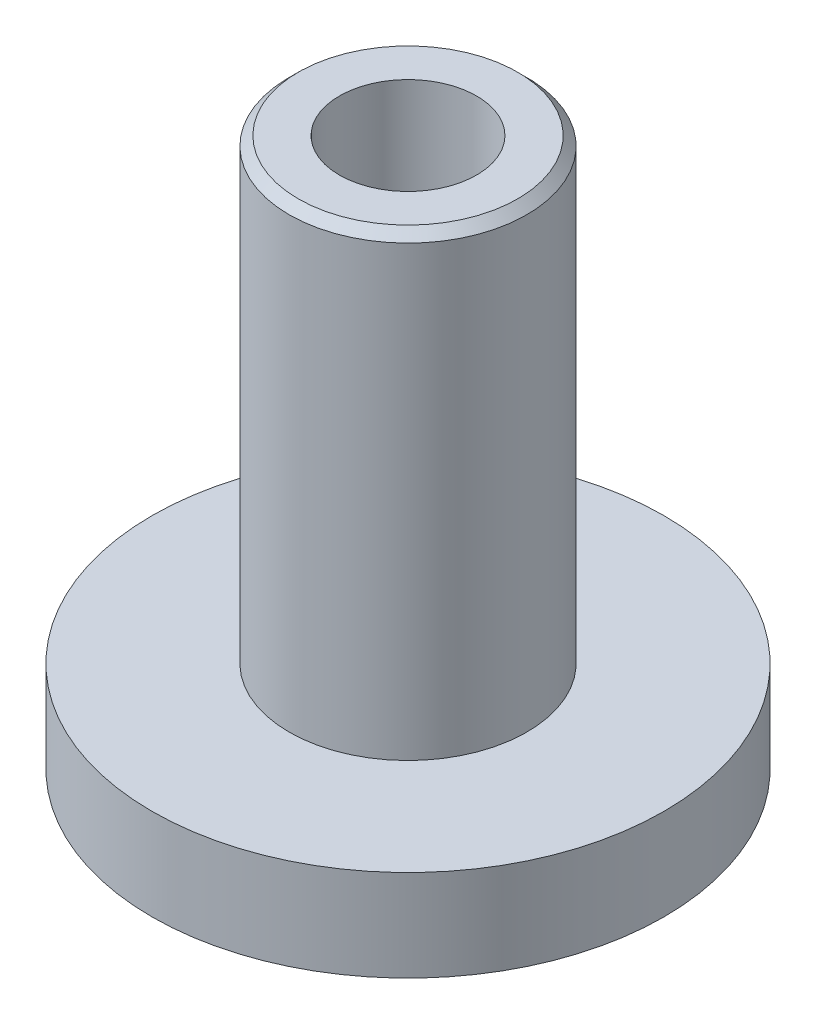
ISO-10303-21;
HEADER;
FILE_DESCRIPTION(('STEP AP214'),'2;1');
FILE_NAME('part.step','',(''),(''),'','','');
FILE_SCHEMA(('AUTOMOTIVE_DESIGN { 1 0 10303 214 1 1 1 1 }'));
ENDSEC;
DATA;
#1=APPLICATION_CONTEXT('core data for automotive mechanical design processes');
#2=APPLICATION_PROTOCOL_DEFINITION('international standard','automotive_design',2000,#1);
#3=PRODUCT_CONTEXT('',#1,'mechanical');
#4=PRODUCT('Part','Part','',(#3));
#5=PRODUCT_RELATED_PRODUCT_CATEGORY('part','',(#4));
#6=PRODUCT_DEFINITION_FORMATION('','',#4);
#7=PRODUCT_DEFINITION_CONTEXT('part definition',#1,'design');
#8=PRODUCT_DEFINITION('design','',#6,#7);
#9=PRODUCT_DEFINITION_SHAPE('','',#8);
#10=(LENGTH_UNIT() NAMED_UNIT(*) SI_UNIT(.MILLI.,.METRE.));
#11=(NAMED_UNIT(*) PLANE_ANGLE_UNIT() SI_UNIT($,.RADIAN.));
#12=(NAMED_UNIT(*) SI_UNIT($,.STERADIAN.) SOLID_ANGLE_UNIT());
#13=UNCERTAINTY_MEASURE_WITH_UNIT(LENGTH_MEASURE(1.E-05),#10,'distance_accuracy_value','');
#14=(GEOMETRIC_REPRESENTATION_CONTEXT(3) GLOBAL_UNCERTAINTY_ASSIGNED_CONTEXT((#13)) GLOBAL_UNIT_ASSIGNED_CONTEXT((#10,
#11,#12)) REPRESENTATION_CONTEXT('',''));
#15=CARTESIAN_POINT('',(0.,0.,0.));
#16=DIRECTION('',(0.,0.,1.));
#17=DIRECTION('',(1.,0.,0.));
#18=AXIS2_PLACEMENT_3D('',#15,#16,#17);
#19=CARTESIAN_POINT('',(0.,10.,0.));
#20=DIRECTION('',(0.,-1.,0.));
#21=DIRECTION('',(0.,0.,-1.));
#22=AXIS2_PLACEMENT_3D('',#19,#20,#21);
#23=CYLINDRICAL_SURFACE('',#22,28.);
#24=CARTESIAN_POINT('',(0.,10.,0.));
#25=DIRECTION('',(0.,1.,0.));
#26=DIRECTION('',(0.,0.,1.));
#27=AXIS2_PLACEMENT_3D('',#24,#25,#26);
#28=CIRCLE('',#27,28.);
#29=CARTESIAN_POINT('',(0.,10.,28.));
#30=VERTEX_POINT('',#29);
#31=EDGE_CURVE('E54',#30,#30,#28,.T.);
#32=ORIENTED_EDGE('',*,*,#31,.F.);
#33=EDGE_LOOP('',(#32));
#34=FACE_BOUND('',#33,.T.);
#35=CARTESIAN_POINT('',(0.,0.,0.));
#36=DIRECTION('',(0.,1.,0.));
#37=DIRECTION('',(0.,0.,1.));
#38=AXIS2_PLACEMENT_3D('',#35,#36,#37);
#39=CIRCLE('',#38,28.);
#40=CARTESIAN_POINT('',(0.,0.,28.));
#41=VERTEX_POINT('',#40);
#42=EDGE_CURVE('E57',#41,#41,#39,.T.);
#43=ORIENTED_EDGE('',*,*,#42,.T.);
#44=EDGE_LOOP('',(#43));
#45=FACE_BOUND('',#44,.T.);
#46=ADVANCED_FACE('F39',(#34,#45),#23,.T.);
#47=CARTESIAN_POINT('',(0.,10.,0.));
#48=DIRECTION('',(0.,1.,0.));
#49=DIRECTION('',(0.,0.,1.));
#50=AXIS2_PLACEMENT_3D('',#47,#48,#49);
#51=PLANE('',#50);
#52=CARTESIAN_POINT('',(0.,10.,0.));
#53=DIRECTION('',(0.,1.,0.));
#54=DIRECTION('',(0.,0.,1.));
#55=AXIS2_PLACEMENT_3D('',#52,#53,#54);
#56=CIRCLE('',#55,13.);
#57=CARTESIAN_POINT('',(0.,10.,13.));
#58=VERTEX_POINT('',#57);
#59=EDGE_CURVE('E60',#58,#58,#56,.T.);
#60=ORIENTED_EDGE('',*,*,#59,.F.);
#61=EDGE_LOOP('',(#60));
#62=FACE_BOUND('',#61,.T.);
#63=ORIENTED_EDGE('',*,*,#31,.T.);
#64=EDGE_LOOP('',(#63));
#65=FACE_BOUND('',#64,.T.);
#66=ADVANCED_FACE('F82',(#62,#65),#51,.T.);
#67=CARTESIAN_POINT('',(0.,0.,0.));
#68=DIRECTION('',(0.,1.,0.));
#69=DIRECTION('',(0.,0.,1.));
#70=AXIS2_PLACEMENT_3D('',#67,#68,#69);
#71=PLANE('',#70);
#72=ORIENTED_EDGE('',*,*,#42,.F.);
#73=EDGE_LOOP('',(#72));
#74=FACE_BOUND('',#73,.T.);
#75=ADVANCED_FACE('F75',(#74),#71,.F.);
#76=CARTESIAN_POINT('',(0.,60.,0.));
#77=DIRECTION('',(0.,1.,0.));
#78=DIRECTION('',(0.,0.,1.));
#79=AXIS2_PLACEMENT_3D('',#76,#77,#78);
#80=PLANE('',#79);
#81=CARTESIAN_POINT('',(0.,60.,0.));
#82=DIRECTION('',(0.,1.,0.));
#83=DIRECTION('',(0.,0.,1.));
#84=AXIS2_PLACEMENT_3D('',#81,#82,#83);
#85=CIRCLE('',#84,12.);
#86=CARTESIAN_POINT('',(0.,60.,12.));
#87=VERTEX_POINT('',#86);
#88=EDGE_CURVE('E46',#87,#87,#85,.T.);
#89=ORIENTED_EDGE('',*,*,#88,.T.);
#90=EDGE_LOOP('',(#89));
#91=FACE_BOUND('',#90,.T.);
#92=CARTESIAN_POINT('',(0.,60.,0.));
#93=DIRECTION('',(0.,1.,0.));
#94=DIRECTION('',(0.,0.,1.));
#95=AXIS2_PLACEMENT_3D('',#92,#93,#94);
#96=CIRCLE('',#95,7.5);
#97=CARTESIAN_POINT('',(0.,60.,7.5));
#98=VERTEX_POINT('',#97);
#99=EDGE_CURVE('E65',#98,#98,#96,.T.);
#100=ORIENTED_EDGE('',*,*,#99,.F.);
#101=EDGE_LOOP('',(#100));
#102=FACE_BOUND('',#101,.T.);
#103=ADVANCED_FACE('F72',(#91,#102),#80,.T.);
#104=CARTESIAN_POINT('',(0.,60.,0.));
#105=DIRECTION('',(0.,-1.,0.));
#106=DIRECTION('',(0.,0.,-1.));
#107=AXIS2_PLACEMENT_3D('',#104,#105,#106);
#108=CYLINDRICAL_SURFACE('',#107,13.);
#109=CARTESIAN_POINT('',(0.,59.,0.));
#110=DIRECTION('',(0.,1.,0.));
#111=DIRECTION('',(0.,0.,1.));
#112=AXIS2_PLACEMENT_3D('',#109,#110,#111);
#113=CIRCLE('',#112,13.);
#114=CARTESIAN_POINT('',(0.,59.,13.));
#115=VERTEX_POINT('',#114);
#116=EDGE_CURVE('E11',#115,#115,#113,.F.);
#117=ORIENTED_EDGE('',*,*,#116,.T.);
#118=EDGE_LOOP('',(#117));
#119=FACE_BOUND('',#118,.T.);
#120=ORIENTED_EDGE('',*,*,#59,.T.);
#121=EDGE_LOOP('',(#120));
#122=FACE_BOUND('',#121,.T.);
#123=ADVANCED_FACE('F74',(#119,#122),#108,.T.);
#124=CARTESIAN_POINT('',(0.,60.,0.));
#125=DIRECTION('',(0.,-1.,0.));
#126=DIRECTION('',(0.,0.,-1.));
#127=AXIS2_PLACEMENT_3D('',#124,#125,#126);
#128=CYLINDRICAL_SURFACE('',#127,7.5);
#129=ORIENTED_EDGE('',*,*,#99,.T.);
#130=EDGE_LOOP('',(#129));
#131=FACE_BOUND('',#130,.T.);
#132=CARTESIAN_POINT('',(0.,10.,0.));
#133=DIRECTION('',(0.,1.,0.));
#134=DIRECTION('',(0.,0.,1.));
#135=AXIS2_PLACEMENT_3D('',#132,#133,#134);
#136=CIRCLE('',#135,7.5);
#137=CARTESIAN_POINT('',(0.,10.,7.5));
#138=VERTEX_POINT('',#137);
#139=EDGE_CURVE('E50',#138,#138,#136,.F.);
#140=ORIENTED_EDGE('',*,*,#139,.T.);
#141=EDGE_LOOP('',(#140));
#142=FACE_BOUND('',#141,.T.);
#143=ADVANCED_FACE('F69',(#131,#142),#128,.F.);
#144=ORIENTED_EDGE('',*,*,#139,.F.);
#145=EDGE_LOOP('',(#144));
#146=FACE_BOUND('',#145,.T.);
#147=ADVANCED_FACE('F93',(#146),#51,.T.);
#148=CARTESIAN_POINT('',(0.,60.,0.));
#149=DIRECTION('',(0.,-1.,0.));
#150=DIRECTION('',(0.,0.,-1.));
#151=AXIS2_PLACEMENT_3D('',#148,#149,#150);
#152=CONICAL_SURFACE('',#151,12.,0.78539816339745);
#153=ORIENTED_EDGE('',*,*,#116,.F.);
#154=EDGE_LOOP('',(#153));
#155=FACE_BOUND('',#154,.T.);
#156=ORIENTED_EDGE('',*,*,#88,.F.);
#157=EDGE_LOOP('',(#156));
#158=FACE_BOUND('',#157,.T.);
#159=ADVANCED_FACE('F41',(#155,#158),#152,.T.);
#160=CLOSED_SHELL('',(#46,#66,#75,#103,#123,#143,#147,#159));
#161=MANIFOLD_SOLID_BREP('B2',#160);
#162=ADVANCED_BREP_SHAPE_REPRESENTATION('',(#18,#161),#14);
#163=SHAPE_DEFINITION_REPRESENTATION(#9,#162);
ENDSEC;
END-ISO-10303-21;
